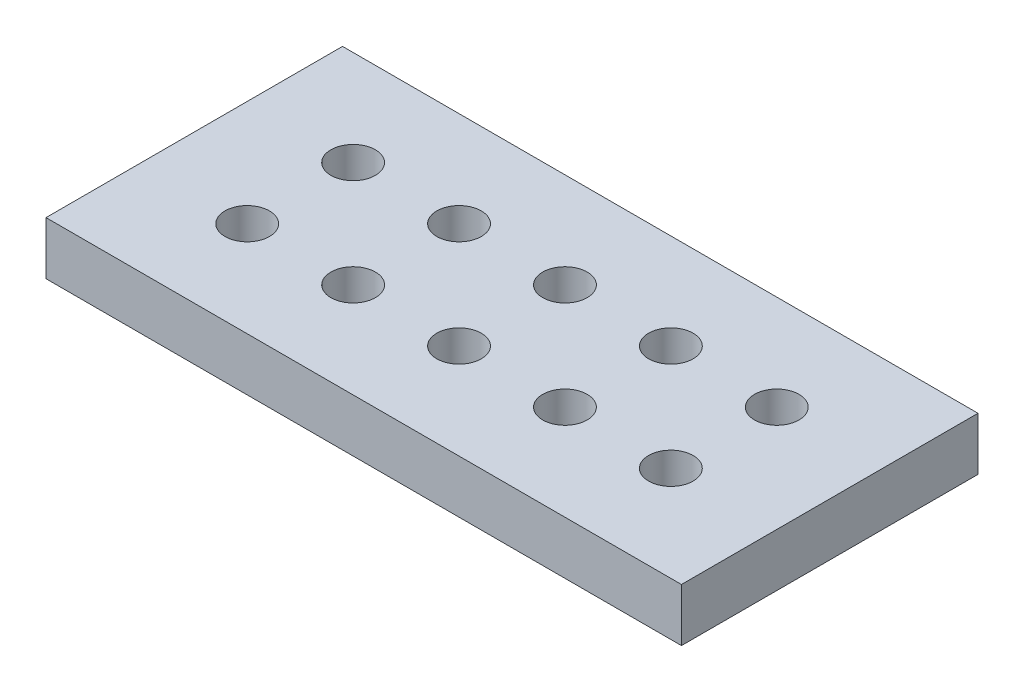
ISO-10303-21;
HEADER;
FILE_DESCRIPTION(('STEP AP214'),'2;1');
FILE_NAME('part.step','',(''),(''),'','','');
FILE_SCHEMA(('AUTOMOTIVE_DESIGN { 1 0 10303 214 1 1 1 1 }'));
ENDSEC;
DATA;
#1=APPLICATION_CONTEXT('core data for automotive mechanical design processes');
#2=APPLICATION_PROTOCOL_DEFINITION('international standard','automotive_design',2000,#1);
#3=PRODUCT_CONTEXT('',#1,'mechanical');
#4=PRODUCT('Part','Part','',(#3));
#5=PRODUCT_RELATED_PRODUCT_CATEGORY('part','',(#4));
#6=PRODUCT_DEFINITION_FORMATION('','',#4);
#7=PRODUCT_DEFINITION_CONTEXT('part definition',#1,'design');
#8=PRODUCT_DEFINITION('design','',#6,#7);
#9=PRODUCT_DEFINITION_SHAPE('','',#8);
#10=(LENGTH_UNIT() NAMED_UNIT(*) SI_UNIT(.MILLI.,.METRE.));
#11=(NAMED_UNIT(*) PLANE_ANGLE_UNIT() SI_UNIT($,.RADIAN.));
#12=(NAMED_UNIT(*) SI_UNIT($,.STERADIAN.) SOLID_ANGLE_UNIT());
#13=UNCERTAINTY_MEASURE_WITH_UNIT(LENGTH_MEASURE(1.E-05),#10,'distance_accuracy_value','');
#14=(GEOMETRIC_REPRESENTATION_CONTEXT(3) GLOBAL_UNCERTAINTY_ASSIGNED_CONTEXT((#13)) GLOBAL_UNIT_ASSIGNED_CONTEXT((#10,
#11,#12)) REPRESENTATION_CONTEXT('',''));
#15=CARTESIAN_POINT('',(0.,0.,0.));
#16=DIRECTION('',(0.,0.,1.));
#17=DIRECTION('',(1.,0.,0.));
#18=AXIS2_PLACEMENT_3D('',#15,#16,#17);
#19=CARTESIAN_POINT('',(0.,3.175,0.));
#20=DIRECTION('',(0.,-1.,0.));
#21=DIRECTION('',(0.,0.,-1.));
#22=AXIS2_PLACEMENT_3D('',#19,#20,#21);
#23=PLANE('',#22);
#24=DIRECTION('',(0.,0.,1.));
#25=VECTOR('',#24,1.);
#26=CARTESIAN_POINT('',(-38.1000000000001,3.175,-17.78));
#27=LINE('',#26,#25);
#28=CARTESIAN_POINT('',(-38.1000000000001,3.175,-17.78));
#29=VERTEX_POINT('',#28);
#30=CARTESIAN_POINT('',(-38.1,3.175,17.78));
#31=VERTEX_POINT('',#30);
#32=EDGE_CURVE('E85',#29,#31,#27,.T.);
#33=ORIENTED_EDGE('',*,*,#32,.T.);
#34=DIRECTION('',(1.,0.,0.));
#35=VECTOR('',#34,1.);
#36=CARTESIAN_POINT('',(38.0999999999999,3.175,17.78));
#37=LINE('',#36,#35);
#38=CARTESIAN_POINT('',(38.0999999999999,3.175,17.78));
#39=VERTEX_POINT('',#38);
#40=EDGE_CURVE('E80',#31,#39,#37,.T.);
#41=ORIENTED_EDGE('',*,*,#40,.T.);
#42=DIRECTION('',(0.,0.,-1.));
#43=VECTOR('',#42,1.);
#44=CARTESIAN_POINT('',(38.0999999999999,3.175,-17.78));
#45=LINE('',#44,#43);
#46=CARTESIAN_POINT('',(38.0999999999999,3.175,-17.78));
#47=VERTEX_POINT('',#46);
#48=EDGE_CURVE('E83',#39,#47,#45,.T.);
#49=ORIENTED_EDGE('',*,*,#48,.T.);
#50=DIRECTION('',(-1.,0.,0.));
#51=VECTOR('',#50,1.);
#52=CARTESIAN_POINT('',(38.0999999999999,3.175,-17.78));
#53=LINE('',#52,#51);
#54=EDGE_CURVE('E50',#47,#29,#53,.T.);
#55=ORIENTED_EDGE('',*,*,#54,.T.);
#56=EDGE_LOOP('',(#33,#41,#49,#55));
#57=FACE_BOUND('',#56,.T.);
#58=CARTESIAN_POINT('',(-25.4,3.175,-6.35));
#59=DIRECTION('',(0.,1.,0.));
#60=DIRECTION('',(0.,0.,1.));
#61=AXIS2_PLACEMENT_3D('',#58,#59,#60);
#62=CIRCLE('',#61,2.667);
#63=CARTESIAN_POINT('',(-25.4,3.175,-3.683));
#64=VERTEX_POINT('',#63);
#65=EDGE_CURVE('E100',#64,#64,#62,.T.);
#66=ORIENTED_EDGE('',*,*,#65,.F.);
#67=EDGE_LOOP('',(#66));
#68=FACE_BOUND('',#67,.T.);
#69=CARTESIAN_POINT('',(-12.7,3.175,-6.35));
#70=DIRECTION('',(0.,1.,0.));
#71=DIRECTION('',(0.,0.,1.));
#72=AXIS2_PLACEMENT_3D('',#69,#70,#71);
#73=CIRCLE('',#72,2.667);
#74=CARTESIAN_POINT('',(-12.7,3.175,-3.683));
#75=VERTEX_POINT('',#74);
#76=EDGE_CURVE('E115',#75,#75,#73,.T.);
#77=ORIENTED_EDGE('',*,*,#76,.F.);
#78=EDGE_LOOP('',(#77));
#79=FACE_BOUND('',#78,.T.);
#80=CARTESIAN_POINT('',(0.,3.175,-6.35));
#81=DIRECTION('',(0.,1.,0.));
#82=DIRECTION('',(0.,0.,1.));
#83=AXIS2_PLACEMENT_3D('',#80,#81,#82);
#84=CIRCLE('',#83,2.667);
#85=CARTESIAN_POINT('',(0.,3.175,-3.683));
#86=VERTEX_POINT('',#85);
#87=EDGE_CURVE('E121',#86,#86,#84,.T.);
#88=ORIENTED_EDGE('',*,*,#87,.F.);
#89=EDGE_LOOP('',(#88));
#90=FACE_BOUND('',#89,.T.);
#91=CARTESIAN_POINT('',(12.6999999999999,3.175,-6.35));
#92=DIRECTION('',(0.,1.,0.));
#93=DIRECTION('',(0.,0.,1.));
#94=AXIS2_PLACEMENT_3D('',#91,#92,#93);
#95=CIRCLE('',#94,2.667);
#96=CARTESIAN_POINT('',(12.6999999999999,3.175,-3.683));
#97=VERTEX_POINT('',#96);
#98=EDGE_CURVE('E127',#97,#97,#95,.T.);
#99=ORIENTED_EDGE('',*,*,#98,.F.);
#100=EDGE_LOOP('',(#99));
#101=FACE_BOUND('',#100,.T.);
#102=CARTESIAN_POINT('',(25.3999999999999,3.175,-6.35));
#103=DIRECTION('',(0.,1.,0.));
#104=DIRECTION('',(0.,0.,1.));
#105=AXIS2_PLACEMENT_3D('',#102,#103,#104);
#106=CIRCLE('',#105,2.667);
#107=CARTESIAN_POINT('',(25.3999999999999,3.175,-3.683));
#108=VERTEX_POINT('',#107);
#109=EDGE_CURVE('E133',#108,#108,#106,.T.);
#110=ORIENTED_EDGE('',*,*,#109,.F.);
#111=EDGE_LOOP('',(#110));
#112=FACE_BOUND('',#111,.T.);
#113=CARTESIAN_POINT('',(-12.6999999999999,3.175,6.35));
#114=DIRECTION('',(0.,1.,0.));
#115=DIRECTION('',(0.,0.,1.));
#116=AXIS2_PLACEMENT_3D('',#113,#114,#115);
#117=CIRCLE('',#116,2.667);
#118=CARTESIAN_POINT('',(-12.6999999999999,3.175,9.017));
#119=VERTEX_POINT('',#118);
#120=EDGE_CURVE('E139',#119,#119,#117,.T.);
#121=ORIENTED_EDGE('',*,*,#120,.F.);
#122=EDGE_LOOP('',(#121));
#123=FACE_BOUND('',#122,.T.);
#124=CARTESIAN_POINT('',(0.,3.175,6.35));
#125=DIRECTION('',(0.,1.,0.));
#126=DIRECTION('',(0.,0.,1.));
#127=AXIS2_PLACEMENT_3D('',#124,#125,#126);
#128=CIRCLE('',#127,2.667);
#129=CARTESIAN_POINT('',(0.,3.175,9.017));
#130=VERTEX_POINT('',#129);
#131=EDGE_CURVE('E145',#130,#130,#128,.T.);
#132=ORIENTED_EDGE('',*,*,#131,.F.);
#133=EDGE_LOOP('',(#132));
#134=FACE_BOUND('',#133,.T.);
#135=CARTESIAN_POINT('',(12.7000000000001,3.175,6.35));
#136=DIRECTION('',(0.,1.,0.));
#137=DIRECTION('',(0.,0.,1.));
#138=AXIS2_PLACEMENT_3D('',#135,#136,#137);
#139=CIRCLE('',#138,2.667);
#140=CARTESIAN_POINT('',(12.7000000000001,3.175,9.017));
#141=VERTEX_POINT('',#140);
#142=EDGE_CURVE('E151',#141,#141,#139,.T.);
#143=ORIENTED_EDGE('',*,*,#142,.F.);
#144=EDGE_LOOP('',(#143));
#145=FACE_BOUND('',#144,.T.);
#146=CARTESIAN_POINT('',(25.4000000000001,3.175,6.35));
#147=DIRECTION('',(0.,1.,0.));
#148=DIRECTION('',(0.,0.,1.));
#149=AXIS2_PLACEMENT_3D('',#146,#147,#148);
#150=CIRCLE('',#149,2.667);
#151=CARTESIAN_POINT('',(25.4000000000001,3.175,9.017));
#152=VERTEX_POINT('',#151);
#153=EDGE_CURVE('E157',#152,#152,#150,.T.);
#154=ORIENTED_EDGE('',*,*,#153,.F.);
#155=EDGE_LOOP('',(#154));
#156=FACE_BOUND('',#155,.T.);
#157=CARTESIAN_POINT('',(-25.3999999999999,3.175,6.35));
#158=DIRECTION('',(0.,1.,0.));
#159=DIRECTION('',(0.,0.,1.));
#160=AXIS2_PLACEMENT_3D('',#157,#158,#159);
#161=CIRCLE('',#160,2.667);
#162=CARTESIAN_POINT('',(-25.3999999999999,3.175,9.017));
#163=VERTEX_POINT('',#162);
#164=EDGE_CURVE('E163',#163,#163,#161,.T.);
#165=ORIENTED_EDGE('',*,*,#164,.F.);
#166=EDGE_LOOP('',(#165));
#167=FACE_BOUND('',#166,.T.);
#168=ADVANCED_FACE('F33',(#57,#68,#79,#90,#101,#112,#123,#134,#145,#156,#167),#23,.F.);
#169=CARTESIAN_POINT('',(0.,-3.175,0.));
#170=DIRECTION('',(0.,-1.,0.));
#171=DIRECTION('',(0.,0.,-1.));
#172=AXIS2_PLACEMENT_3D('',#169,#170,#171);
#173=PLANE('',#172);
#174=CARTESIAN_POINT('',(25.4000000000001,-3.175,6.35));
#175=DIRECTION('',(0.,1.,0.));
#176=DIRECTION('',(0.,0.,1.));
#177=AXIS2_PLACEMENT_3D('',#174,#175,#176);
#178=CIRCLE('',#177,2.667);
#179=CARTESIAN_POINT('',(25.4000000000001,-3.175,9.017));
#180=VERTEX_POINT('',#179);
#181=EDGE_CURVE('E160',#180,#180,#178,.T.);
#182=ORIENTED_EDGE('',*,*,#181,.T.);
#183=EDGE_LOOP('',(#182));
#184=FACE_BOUND('',#183,.T.);
#185=CARTESIAN_POINT('',(0.,-3.175,6.35));
#186=DIRECTION('',(0.,1.,0.));
#187=DIRECTION('',(0.,0.,1.));
#188=AXIS2_PLACEMENT_3D('',#185,#186,#187);
#189=CIRCLE('',#188,2.667);
#190=CARTESIAN_POINT('',(0.,-3.175,9.017));
#191=VERTEX_POINT('',#190);
#192=EDGE_CURVE('E148',#191,#191,#189,.T.);
#193=ORIENTED_EDGE('',*,*,#192,.T.);
#194=EDGE_LOOP('',(#193));
#195=FACE_BOUND('',#194,.T.);
#196=CARTESIAN_POINT('',(25.3999999999999,-3.175,-6.35));
#197=DIRECTION('',(0.,1.,0.));
#198=DIRECTION('',(0.,0.,1.));
#199=AXIS2_PLACEMENT_3D('',#196,#197,#198);
#200=CIRCLE('',#199,2.667);
#201=CARTESIAN_POINT('',(25.3999999999999,-3.175,-3.683));
#202=VERTEX_POINT('',#201);
#203=EDGE_CURVE('E136',#202,#202,#200,.T.);
#204=ORIENTED_EDGE('',*,*,#203,.T.);
#205=EDGE_LOOP('',(#204));
#206=FACE_BOUND('',#205,.T.);
#207=CARTESIAN_POINT('',(0.,-3.175,-6.35));
#208=DIRECTION('',(0.,1.,0.));
#209=DIRECTION('',(0.,0.,1.));
#210=AXIS2_PLACEMENT_3D('',#207,#208,#209);
#211=CIRCLE('',#210,2.667);
#212=CARTESIAN_POINT('',(0.,-3.175,-3.683));
#213=VERTEX_POINT('',#212);
#214=EDGE_CURVE('E124',#213,#213,#211,.T.);
#215=ORIENTED_EDGE('',*,*,#214,.T.);
#216=EDGE_LOOP('',(#215));
#217=FACE_BOUND('',#216,.T.);
#218=CARTESIAN_POINT('',(-25.4,-3.175,-6.35));
#219=DIRECTION('',(0.,1.,0.));
#220=DIRECTION('',(0.,0.,1.));
#221=AXIS2_PLACEMENT_3D('',#218,#219,#220);
#222=CIRCLE('',#221,2.667);
#223=CARTESIAN_POINT('',(-25.4,-3.175,-3.683));
#224=VERTEX_POINT('',#223);
#225=EDGE_CURVE('E112',#224,#224,#222,.T.);
#226=ORIENTED_EDGE('',*,*,#225,.T.);
#227=EDGE_LOOP('',(#226));
#228=FACE_BOUND('',#227,.T.);
#229=DIRECTION('',(0.,0.,1.));
#230=VECTOR('',#229,1.);
#231=CARTESIAN_POINT('',(-38.1000000000001,-3.175,-17.78));
#232=LINE('',#231,#230);
#233=CARTESIAN_POINT('',(-38.1000000000001,-3.175,-17.78));
#234=VERTEX_POINT('',#233);
#235=CARTESIAN_POINT('',(-38.1,-3.175,17.78));
#236=VERTEX_POINT('',#235);
#237=EDGE_CURVE('E97',#234,#236,#232,.T.);
#238=ORIENTED_EDGE('',*,*,#237,.F.);
#239=DIRECTION('',(-1.,0.,0.));
#240=VECTOR('',#239,1.);
#241=CARTESIAN_POINT('',(38.0999999999999,-3.175,-17.78));
#242=LINE('',#241,#240);
#243=CARTESIAN_POINT('',(38.0999999999999,-3.175,-17.78));
#244=VERTEX_POINT('',#243);
#245=EDGE_CURVE('E73',#244,#234,#242,.T.);
#246=ORIENTED_EDGE('',*,*,#245,.F.);
#247=DIRECTION('',(0.,0.,-1.));
#248=VECTOR('',#247,1.);
#249=CARTESIAN_POINT('',(38.0999999999999,-3.175,-17.78));
#250=LINE('',#249,#248);
#251=CARTESIAN_POINT('',(38.0999999999999,-3.175,17.78));
#252=VERTEX_POINT('',#251);
#253=EDGE_CURVE('E67',#252,#244,#250,.T.);
#254=ORIENTED_EDGE('',*,*,#253,.F.);
#255=DIRECTION('',(1.,0.,0.));
#256=VECTOR('',#255,1.);
#257=CARTESIAN_POINT('',(38.0999999999999,-3.175,17.78));
#258=LINE('',#257,#256);
#259=EDGE_CURVE('E89',#236,#252,#258,.T.);
#260=ORIENTED_EDGE('',*,*,#259,.F.);
#261=EDGE_LOOP('',(#238,#246,#254,#260));
#262=FACE_BOUND('',#261,.T.);
#263=CARTESIAN_POINT('',(-12.7,-3.175,-6.35));
#264=DIRECTION('',(0.,1.,0.));
#265=DIRECTION('',(0.,0.,1.));
#266=AXIS2_PLACEMENT_3D('',#263,#264,#265);
#267=CIRCLE('',#266,2.667);
#268=CARTESIAN_POINT('',(-12.7,-3.175,-3.683));
#269=VERTEX_POINT('',#268);
#270=EDGE_CURVE('E118',#269,#269,#267,.T.);
#271=ORIENTED_EDGE('',*,*,#270,.T.);
#272=EDGE_LOOP('',(#271));
#273=FACE_BOUND('',#272,.T.);
#274=CARTESIAN_POINT('',(12.6999999999999,-3.175,-6.35));
#275=DIRECTION('',(0.,1.,0.));
#276=DIRECTION('',(0.,0.,1.));
#277=AXIS2_PLACEMENT_3D('',#274,#275,#276);
#278=CIRCLE('',#277,2.667);
#279=CARTESIAN_POINT('',(12.6999999999999,-3.175,-3.683));
#280=VERTEX_POINT('',#279);
#281=EDGE_CURVE('E130',#280,#280,#278,.T.);
#282=ORIENTED_EDGE('',*,*,#281,.T.);
#283=EDGE_LOOP('',(#282));
#284=FACE_BOUND('',#283,.T.);
#285=CARTESIAN_POINT('',(-12.6999999999999,-3.175,6.35));
#286=DIRECTION('',(0.,1.,0.));
#287=DIRECTION('',(0.,0.,1.));
#288=AXIS2_PLACEMENT_3D('',#285,#286,#287);
#289=CIRCLE('',#288,2.667);
#290=CARTESIAN_POINT('',(-12.6999999999999,-3.175,9.017));
#291=VERTEX_POINT('',#290);
#292=EDGE_CURVE('E142',#291,#291,#289,.T.);
#293=ORIENTED_EDGE('',*,*,#292,.T.);
#294=EDGE_LOOP('',(#293));
#295=FACE_BOUND('',#294,.T.);
#296=CARTESIAN_POINT('',(12.7000000000001,-3.175,6.35));
#297=DIRECTION('',(0.,1.,0.));
#298=DIRECTION('',(0.,0.,1.));
#299=AXIS2_PLACEMENT_3D('',#296,#297,#298);
#300=CIRCLE('',#299,2.667);
#301=CARTESIAN_POINT('',(12.7000000000001,-3.175,9.017));
#302=VERTEX_POINT('',#301);
#303=EDGE_CURVE('E154',#302,#302,#300,.T.);
#304=ORIENTED_EDGE('',*,*,#303,.T.);
#305=EDGE_LOOP('',(#304));
#306=FACE_BOUND('',#305,.T.);
#307=CARTESIAN_POINT('',(-25.3999999999999,-3.175,6.35));
#308=DIRECTION('',(0.,1.,0.));
#309=DIRECTION('',(0.,0.,1.));
#310=AXIS2_PLACEMENT_3D('',#307,#308,#309);
#311=CIRCLE('',#310,2.667);
#312=CARTESIAN_POINT('',(-25.3999999999999,-3.175,9.017));
#313=VERTEX_POINT('',#312);
#314=EDGE_CURVE('E166',#313,#313,#311,.T.);
#315=ORIENTED_EDGE('',*,*,#314,.T.);
#316=EDGE_LOOP('',(#315));
#317=FACE_BOUND('',#316,.T.);
#318=ADVANCED_FACE('F108',(#184,#195,#206,#217,#228,#262,#273,#284,#295,#306,#317),#173,.T.);
#319=CARTESIAN_POINT('',(-38.1000000000001,3.175,-17.78));
#320=DIRECTION('',(1.,0.,0.));
#321=DIRECTION('',(0.,0.,-1.));
#322=AXIS2_PLACEMENT_3D('',#319,#320,#321);
#323=PLANE('',#322);
#324=CARTESIAN_POINT('',(-38.1000000000001,0.,-12.7));
#325=DIRECTION('',(-1.,0.,0.));
#326=DIRECTION('',(0.,0.,1.));
#327=AXIS2_PLACEMENT_3D('',#324,#325,#326);
#328=CIRCLE('',#327,1.3462);
#329=CARTESIAN_POINT('',(-38.1000000000001,0.,-11.3538));
#330=VERTEX_POINT('',#329);
#331=EDGE_CURVE('E185',#330,#330,#328,.T.);
#332=ORIENTED_EDGE('',*,*,#331,.F.);
#333=EDGE_LOOP('',(#332));
#334=FACE_BOUND('',#333,.T.);
#335=CARTESIAN_POINT('',(-38.1000000000001,0.,12.7));
#336=DIRECTION('',(-1.,0.,0.));
#337=DIRECTION('',(0.,0.,1.));
#338=AXIS2_PLACEMENT_3D('',#335,#336,#337);
#339=CIRCLE('',#338,1.3462);
#340=CARTESIAN_POINT('',(-38.1000000000001,0.,14.0462));
#341=VERTEX_POINT('',#340);
#342=EDGE_CURVE('E186',#341,#341,#339,.T.);
#343=ORIENTED_EDGE('',*,*,#342,.F.);
#344=EDGE_LOOP('',(#343));
#345=FACE_BOUND('',#344,.T.);
#346=CARTESIAN_POINT('',(-38.1000000000001,0.,0.));
#347=DIRECTION('',(-1.,0.,0.));
#348=DIRECTION('',(0.,0.,1.));
#349=AXIS2_PLACEMENT_3D('',#346,#347,#348);
#350=CIRCLE('',#349,1.3462);
#351=CARTESIAN_POINT('',(-38.1000000000001,0.,1.34620000000001));
#352=VERTEX_POINT('',#351);
#353=EDGE_CURVE('E192',#352,#352,#350,.T.);
#354=ORIENTED_EDGE('',*,*,#353,.F.);
#355=EDGE_LOOP('',(#354));
#356=FACE_BOUND('',#355,.T.);
#357=CARTESIAN_POINT('',(-38.1000000000001,0.,-6.34999999999999));
#358=DIRECTION('',(-1.,0.,0.));
#359=DIRECTION('',(0.,0.,1.));
#360=AXIS2_PLACEMENT_3D('',#357,#358,#359);
#361=CIRCLE('',#360,1.3462);
#362=CARTESIAN_POINT('',(-38.1000000000001,0.,-5.00379999999998));
#363=VERTEX_POINT('',#362);
#364=EDGE_CURVE('E172',#363,#363,#361,.T.);
#365=ORIENTED_EDGE('',*,*,#364,.F.);
#366=EDGE_LOOP('',(#365));
#367=FACE_BOUND('',#366,.T.);
#368=CARTESIAN_POINT('',(-38.1000000000001,0.,6.35000000000001));
#369=DIRECTION('',(-1.,0.,0.));
#370=DIRECTION('',(0.,0.,1.));
#371=AXIS2_PLACEMENT_3D('',#368,#369,#370);
#372=CIRCLE('',#371,1.3462);
#373=CARTESIAN_POINT('',(-38.1000000000001,0.,7.69620000000001));
#374=VERTEX_POINT('',#373);
#375=EDGE_CURVE('E179',#374,#374,#372,.T.);
#376=ORIENTED_EDGE('',*,*,#375,.F.);
#377=EDGE_LOOP('',(#376));
#378=FACE_BOUND('',#377,.T.);
#379=ORIENTED_EDGE('',*,*,#237,.T.);
#380=DIRECTION('',(0.,-1.,0.));
#381=VECTOR('',#380,1.);
#382=CARTESIAN_POINT('',(-38.1,3.175,17.78));
#383=LINE('',#382,#381);
#384=EDGE_CURVE('E11',#31,#236,#383,.T.);
#385=ORIENTED_EDGE('',*,*,#384,.F.);
#386=ORIENTED_EDGE('',*,*,#32,.F.);
#387=DIRECTION('',(0.,-1.,0.));
#388=VECTOR('',#387,1.);
#389=CARTESIAN_POINT('',(-38.1000000000001,3.175,-17.78));
#390=LINE('',#389,#388);
#391=EDGE_CURVE('E93',#29,#234,#390,.T.);
#392=ORIENTED_EDGE('',*,*,#391,.T.);
#393=EDGE_LOOP('',(#379,#385,#386,#392));
#394=FACE_BOUND('',#393,.T.);
#395=ADVANCED_FACE('F35',(#334,#345,#356,#367,#378,#394),#323,.F.);
#396=CARTESIAN_POINT('',(38.0999999999999,3.175,17.78));
#397=DIRECTION('',(0.,0.,-1.));
#398=DIRECTION('',(-1.,0.,0.));
#399=AXIS2_PLACEMENT_3D('',#396,#397,#398);
#400=PLANE('',#399);
#401=ORIENTED_EDGE('',*,*,#259,.T.);
#402=DIRECTION('',(0.,-1.,0.));
#403=VECTOR('',#402,1.);
#404=CARTESIAN_POINT('',(38.0999999999999,3.175,17.78));
#405=LINE('',#404,#403);
#406=EDGE_CURVE('E42',#39,#252,#405,.T.);
#407=ORIENTED_EDGE('',*,*,#406,.F.);
#408=ORIENTED_EDGE('',*,*,#40,.F.);
#409=ORIENTED_EDGE('',*,*,#384,.T.);
#410=EDGE_LOOP('',(#401,#407,#408,#409));
#411=FACE_BOUND('',#410,.T.);
#412=ADVANCED_FACE('F88',(#411),#400,.F.);
#413=CARTESIAN_POINT('',(38.0999999999999,3.175,-17.78));
#414=DIRECTION('',(-1.,0.,0.));
#415=DIRECTION('',(0.,0.,1.));
#416=AXIS2_PLACEMENT_3D('',#413,#414,#415);
#417=PLANE('',#416);
#418=ORIENTED_EDGE('',*,*,#253,.T.);
#419=DIRECTION('',(0.,-1.,0.));
#420=VECTOR('',#419,1.);
#421=CARTESIAN_POINT('',(38.0999999999999,3.175,-17.78));
#422=LINE('',#421,#420);
#423=EDGE_CURVE('E90',#47,#244,#422,.T.);
#424=ORIENTED_EDGE('',*,*,#423,.F.);
#425=ORIENTED_EDGE('',*,*,#48,.F.);
#426=ORIENTED_EDGE('',*,*,#406,.T.);
#427=EDGE_LOOP('',(#418,#424,#425,#426));
#428=FACE_BOUND('',#427,.T.);
#429=ADVANCED_FACE('F91',(#428),#417,.F.);
#430=CARTESIAN_POINT('',(38.0999999999999,3.175,-17.78));
#431=DIRECTION('',(0.,0.,1.));
#432=DIRECTION('',(1.,0.,0.));
#433=AXIS2_PLACEMENT_3D('',#430,#431,#432);
#434=PLANE('',#433);
#435=ORIENTED_EDGE('',*,*,#245,.T.);
#436=ORIENTED_EDGE('',*,*,#391,.F.);
#437=ORIENTED_EDGE('',*,*,#54,.F.);
#438=ORIENTED_EDGE('',*,*,#423,.T.);
#439=EDGE_LOOP('',(#435,#436,#437,#438));
#440=FACE_BOUND('',#439,.T.);
#441=ADVANCED_FACE('F105',(#440),#434,.F.);
#442=CARTESIAN_POINT('',(-25.4,3.175,-6.35));
#443=DIRECTION('',(0.,-1.,0.));
#444=DIRECTION('',(0.,0.,-1.));
#445=AXIS2_PLACEMENT_3D('',#442,#443,#444);
#446=CYLINDRICAL_SURFACE('',#445,2.667);
#447=ORIENTED_EDGE('',*,*,#65,.T.);
#448=EDGE_LOOP('',(#447));
#449=FACE_BOUND('',#448,.T.);
#450=ORIENTED_EDGE('',*,*,#225,.F.);
#451=EDGE_LOOP('',(#450));
#452=FACE_BOUND('',#451,.T.);
#453=ADVANCED_FACE('F247',(#449,#452),#446,.F.);
#454=CARTESIAN_POINT('',(-12.7,3.175,-6.35));
#455=DIRECTION('',(0.,-1.,0.));
#456=DIRECTION('',(0.,0.,-1.));
#457=AXIS2_PLACEMENT_3D('',#454,#455,#456);
#458=CYLINDRICAL_SURFACE('',#457,2.667);
#459=ORIENTED_EDGE('',*,*,#76,.T.);
#460=EDGE_LOOP('',(#459));
#461=FACE_BOUND('',#460,.T.);
#462=ORIENTED_EDGE('',*,*,#270,.F.);
#463=EDGE_LOOP('',(#462));
#464=FACE_BOUND('',#463,.T.);
#465=ADVANCED_FACE('F273',(#461,#464),#458,.F.);
#466=CARTESIAN_POINT('',(0.,3.175,-6.35));
#467=DIRECTION('',(0.,-1.,0.));
#468=DIRECTION('',(0.,0.,-1.));
#469=AXIS2_PLACEMENT_3D('',#466,#467,#468);
#470=CYLINDRICAL_SURFACE('',#469,2.667);
#471=ORIENTED_EDGE('',*,*,#87,.T.);
#472=EDGE_LOOP('',(#471));
#473=FACE_BOUND('',#472,.T.);
#474=ORIENTED_EDGE('',*,*,#214,.F.);
#475=EDGE_LOOP('',(#474));
#476=FACE_BOUND('',#475,.T.);
#477=ADVANCED_FACE('F280',(#473,#476),#470,.F.);
#478=CARTESIAN_POINT('',(12.6999999999999,3.175,-6.35));
#479=DIRECTION('',(0.,-1.,0.));
#480=DIRECTION('',(0.,0.,-1.));
#481=AXIS2_PLACEMENT_3D('',#478,#479,#480);
#482=CYLINDRICAL_SURFACE('',#481,2.667);
#483=ORIENTED_EDGE('',*,*,#98,.T.);
#484=EDGE_LOOP('',(#483));
#485=FACE_BOUND('',#484,.T.);
#486=ORIENTED_EDGE('',*,*,#281,.F.);
#487=EDGE_LOOP('',(#486));
#488=FACE_BOUND('',#487,.T.);
#489=ADVANCED_FACE('F287',(#485,#488),#482,.F.);
#490=CARTESIAN_POINT('',(25.3999999999999,3.175,-6.35));
#491=DIRECTION('',(0.,-1.,0.));
#492=DIRECTION('',(0.,0.,-1.));
#493=AXIS2_PLACEMENT_3D('',#490,#491,#492);
#494=CYLINDRICAL_SURFACE('',#493,2.667);
#495=ORIENTED_EDGE('',*,*,#109,.T.);
#496=EDGE_LOOP('',(#495));
#497=FACE_BOUND('',#496,.T.);
#498=ORIENTED_EDGE('',*,*,#203,.F.);
#499=EDGE_LOOP('',(#498));
#500=FACE_BOUND('',#499,.T.);
#501=ADVANCED_FACE('F295',(#497,#500),#494,.F.);
#502=CARTESIAN_POINT('',(-12.6999999999999,3.175,6.35));
#503=DIRECTION('',(0.,-1.,0.));
#504=DIRECTION('',(0.,0.,-1.));
#505=AXIS2_PLACEMENT_3D('',#502,#503,#504);
#506=CYLINDRICAL_SURFACE('',#505,2.667);
#507=ORIENTED_EDGE('',*,*,#120,.T.);
#508=EDGE_LOOP('',(#507));
#509=FACE_BOUND('',#508,.T.);
#510=ORIENTED_EDGE('',*,*,#292,.F.);
#511=EDGE_LOOP('',(#510));
#512=FACE_BOUND('',#511,.T.);
#513=ADVANCED_FACE('F303',(#509,#512),#506,.F.);
#514=CARTESIAN_POINT('',(0.,3.175,6.35));
#515=DIRECTION('',(0.,-1.,0.));
#516=DIRECTION('',(0.,0.,-1.));
#517=AXIS2_PLACEMENT_3D('',#514,#515,#516);
#518=CYLINDRICAL_SURFACE('',#517,2.667);
#519=ORIENTED_EDGE('',*,*,#131,.T.);
#520=EDGE_LOOP('',(#519));
#521=FACE_BOUND('',#520,.T.);
#522=ORIENTED_EDGE('',*,*,#192,.F.);
#523=EDGE_LOOP('',(#522));
#524=FACE_BOUND('',#523,.T.);
#525=ADVANCED_FACE('F311',(#521,#524),#518,.F.);
#526=CARTESIAN_POINT('',(12.7000000000001,3.175,6.35));
#527=DIRECTION('',(0.,-1.,0.));
#528=DIRECTION('',(0.,0.,-1.));
#529=AXIS2_PLACEMENT_3D('',#526,#527,#528);
#530=CYLINDRICAL_SURFACE('',#529,2.667);
#531=ORIENTED_EDGE('',*,*,#142,.T.);
#532=EDGE_LOOP('',(#531));
#533=FACE_BOUND('',#532,.T.);
#534=ORIENTED_EDGE('',*,*,#303,.F.);
#535=EDGE_LOOP('',(#534));
#536=FACE_BOUND('',#535,.T.);
#537=ADVANCED_FACE('F319',(#533,#536),#530,.F.);
#538=CARTESIAN_POINT('',(25.4000000000001,3.175,6.35));
#539=DIRECTION('',(0.,-1.,0.));
#540=DIRECTION('',(0.,0.,-1.));
#541=AXIS2_PLACEMENT_3D('',#538,#539,#540);
#542=CYLINDRICAL_SURFACE('',#541,2.667);
#543=ORIENTED_EDGE('',*,*,#153,.T.);
#544=EDGE_LOOP('',(#543));
#545=FACE_BOUND('',#544,.T.);
#546=ORIENTED_EDGE('',*,*,#181,.F.);
#547=EDGE_LOOP('',(#546));
#548=FACE_BOUND('',#547,.T.);
#549=ADVANCED_FACE('F234',(#545,#548),#542,.F.);
#550=CARTESIAN_POINT('',(-25.3999999999999,3.175,6.35));
#551=DIRECTION('',(0.,-1.,0.));
#552=DIRECTION('',(0.,0.,-1.));
#553=AXIS2_PLACEMENT_3D('',#550,#551,#552);
#554=CYLINDRICAL_SURFACE('',#553,2.667);
#555=ORIENTED_EDGE('',*,*,#164,.T.);
#556=EDGE_LOOP('',(#555));
#557=FACE_BOUND('',#556,.T.);
#558=ORIENTED_EDGE('',*,*,#314,.F.);
#559=EDGE_LOOP('',(#558));
#560=FACE_BOUND('',#559,.T.);
#561=ADVANCED_FACE('F224',(#557,#560),#554,.F.);
#562=CARTESIAN_POINT('',(-31.75,0.,6.35000000000001));
#563=DIRECTION('',(-1.,0.,0.));
#564=DIRECTION('',(0.,0.,1.));
#565=AXIS2_PLACEMENT_3D('',#562,#563,#564);
#566=CYLINDRICAL_SURFACE('',#565,1.3462);
#567=CARTESIAN_POINT('',(-31.75,0.,6.35000000000001));
#568=DIRECTION('',(-1.,0.,0.));
#569=DIRECTION('',(0.,0.,1.));
#570=AXIS2_PLACEMENT_3D('',#567,#568,#569);
#571=CIRCLE('',#570,1.3462);
#572=CARTESIAN_POINT('',(-31.75,0.,7.69620000000001));
#573=VERTEX_POINT('',#572);
#574=EDGE_CURVE('E182',#573,#573,#571,.T.);
#575=ORIENTED_EDGE('',*,*,#574,.F.);
#576=EDGE_LOOP('',(#575));
#577=FACE_BOUND('',#576,.T.);
#578=ORIENTED_EDGE('',*,*,#375,.T.);
#579=EDGE_LOOP('',(#578));
#580=FACE_BOUND('',#579,.T.);
#581=ADVANCED_FACE('F221',(#577,#580),#566,.F.);
#582=CARTESIAN_POINT('',(-31.75,0.,6.35000000000001));
#583=DIRECTION('',(-1.,0.,0.));
#584=DIRECTION('',(0.,0.,1.));
#585=AXIS2_PLACEMENT_3D('',#582,#583,#584);
#586=PLANE('',#585);
#587=ORIENTED_EDGE('',*,*,#574,.T.);
#588=EDGE_LOOP('',(#587));
#589=FACE_BOUND('',#588,.T.);
#590=ADVANCED_FACE('F223',(#589),#586,.T.);
#591=CARTESIAN_POINT('',(-31.75,0.,-6.34999999999999));
#592=DIRECTION('',(-1.,0.,0.));
#593=DIRECTION('',(0.,0.,1.));
#594=AXIS2_PLACEMENT_3D('',#591,#592,#593);
#595=CYLINDRICAL_SURFACE('',#594,1.3462);
#596=CARTESIAN_POINT('',(-31.75,0.,-6.34999999999999));
#597=DIRECTION('',(-1.,0.,0.));
#598=DIRECTION('',(0.,0.,1.));
#599=AXIS2_PLACEMENT_3D('',#596,#597,#598);
#600=CIRCLE('',#599,1.3462);
#601=CARTESIAN_POINT('',(-31.75,0.,-5.00379999999998));
#602=VERTEX_POINT('',#601);
#603=EDGE_CURVE('E175',#602,#602,#600,.T.);
#604=ORIENTED_EDGE('',*,*,#603,.F.);
#605=EDGE_LOOP('',(#604));
#606=FACE_BOUND('',#605,.T.);
#607=ORIENTED_EDGE('',*,*,#364,.T.);
#608=EDGE_LOOP('',(#607));
#609=FACE_BOUND('',#608,.T.);
#610=ADVANCED_FACE('F231',(#606,#609),#595,.F.);
#611=CARTESIAN_POINT('',(-31.75,0.,-6.34999999999999));
#612=DIRECTION('',(-1.,0.,0.));
#613=DIRECTION('',(0.,0.,1.));
#614=AXIS2_PLACEMENT_3D('',#611,#612,#613);
#615=PLANE('',#614);
#616=ORIENTED_EDGE('',*,*,#603,.T.);
#617=EDGE_LOOP('',(#616));
#618=FACE_BOUND('',#617,.T.);
#619=ADVANCED_FACE('F363',(#618),#615,.T.);
#620=CARTESIAN_POINT('',(-31.75,0.,0.));
#621=DIRECTION('',(-1.,0.,0.));
#622=DIRECTION('',(0.,0.,1.));
#623=AXIS2_PLACEMENT_3D('',#620,#621,#622);
#624=CYLINDRICAL_SURFACE('',#623,1.3462);
#625=CARTESIAN_POINT('',(-31.75,0.,0.));
#626=DIRECTION('',(-1.,0.,0.));
#627=DIRECTION('',(0.,0.,1.));
#628=AXIS2_PLACEMENT_3D('',#625,#626,#627);
#629=CIRCLE('',#628,1.3462);
#630=CARTESIAN_POINT('',(-31.75,0.,1.34620000000001));
#631=VERTEX_POINT('',#630);
#632=EDGE_CURVE('E176',#631,#631,#629,.T.);
#633=ORIENTED_EDGE('',*,*,#632,.F.);
#634=EDGE_LOOP('',(#633));
#635=FACE_BOUND('',#634,.T.);
#636=ORIENTED_EDGE('',*,*,#353,.T.);
#637=EDGE_LOOP('',(#636));
#638=FACE_BOUND('',#637,.T.);
#639=ADVANCED_FACE('F373',(#635,#638),#624,.F.);
#640=CARTESIAN_POINT('',(-31.75,0.,0.));
#641=DIRECTION('',(-1.,0.,0.));
#642=DIRECTION('',(0.,0.,1.));
#643=AXIS2_PLACEMENT_3D('',#640,#641,#642);
#644=PLANE('',#643);
#645=ORIENTED_EDGE('',*,*,#632,.T.);
#646=EDGE_LOOP('',(#645));
#647=FACE_BOUND('',#646,.T.);
#648=ADVANCED_FACE('F382',(#647),#644,.T.);
#649=CARTESIAN_POINT('',(-31.75,0.,12.7));
#650=DIRECTION('',(-1.,0.,0.));
#651=DIRECTION('',(0.,0.,1.));
#652=AXIS2_PLACEMENT_3D('',#649,#650,#651);
#653=CYLINDRICAL_SURFACE('',#652,1.3462);
#654=CARTESIAN_POINT('',(-31.75,0.,12.7));
#655=DIRECTION('',(-1.,0.,0.));
#656=DIRECTION('',(0.,0.,1.));
#657=AXIS2_PLACEMENT_3D('',#654,#655,#656);
#658=CIRCLE('',#657,1.3462);
#659=CARTESIAN_POINT('',(-31.75,0.,14.0462));
#660=VERTEX_POINT('',#659);
#661=EDGE_CURVE('E189',#660,#660,#658,.T.);
#662=ORIENTED_EDGE('',*,*,#661,.F.);
#663=EDGE_LOOP('',(#662));
#664=FACE_BOUND('',#663,.T.);
#665=ORIENTED_EDGE('',*,*,#342,.T.);
#666=EDGE_LOOP('',(#665));
#667=FACE_BOUND('',#666,.T.);
#668=ADVANCED_FACE('F392',(#664,#667),#653,.F.);
#669=CARTESIAN_POINT('',(-31.75,0.,12.7));
#670=DIRECTION('',(-1.,0.,0.));
#671=DIRECTION('',(0.,0.,1.));
#672=AXIS2_PLACEMENT_3D('',#669,#670,#671);
#673=PLANE('',#672);
#674=ORIENTED_EDGE('',*,*,#661,.T.);
#675=EDGE_LOOP('',(#674));
#676=FACE_BOUND('',#675,.T.);
#677=ADVANCED_FACE('F207',(#676),#673,.T.);
#678=CARTESIAN_POINT('',(-31.75,0.,-12.7));
#679=DIRECTION('',(-1.,0.,0.));
#680=DIRECTION('',(0.,0.,1.));
#681=AXIS2_PLACEMENT_3D('',#678,#679,#680);
#682=CYLINDRICAL_SURFACE('',#681,1.3462);
#683=CARTESIAN_POINT('',(-31.75,0.,-12.7));
#684=DIRECTION('',(-1.,0.,0.));
#685=DIRECTION('',(0.,0.,1.));
#686=AXIS2_PLACEMENT_3D('',#683,#684,#685);
#687=CIRCLE('',#686,1.3462);
#688=CARTESIAN_POINT('',(-31.75,0.,-11.3538));
#689=VERTEX_POINT('',#688);
#690=EDGE_CURVE('E169',#689,#689,#687,.T.);
#691=ORIENTED_EDGE('',*,*,#690,.F.);
#692=EDGE_LOOP('',(#691));
#693=FACE_BOUND('',#692,.T.);
#694=ORIENTED_EDGE('',*,*,#331,.T.);
#695=EDGE_LOOP('',(#694));
#696=FACE_BOUND('',#695,.T.);
#697=ADVANCED_FACE('F204',(#693,#696),#682,.F.);
#698=CARTESIAN_POINT('',(-31.75,0.,-12.7));
#699=DIRECTION('',(-1.,0.,0.));
#700=DIRECTION('',(0.,0.,1.));
#701=AXIS2_PLACEMENT_3D('',#698,#699,#700);
#702=PLANE('',#701);
#703=ORIENTED_EDGE('',*,*,#690,.T.);
#704=EDGE_LOOP('',(#703));
#705=FACE_BOUND('',#704,.T.);
#706=ADVANCED_FACE('F202',(#705),#702,.T.);
#707=CLOSED_SHELL('',(#168,#318,#395,#412,#429,#441,#453,#465,#477,#489,#501,#513,#525,#537,
#549,#561,#581,#590,#610,#619,#639,#648,#668,#677,#697,#706));
#708=MANIFOLD_SOLID_BREP('B2',#707);
#709=ADVANCED_BREP_SHAPE_REPRESENTATION('',(#18,#708),#14);
#710=SHAPE_DEFINITION_REPRESENTATION(#9,#709);
ENDSEC;
END-ISO-10303-21;
